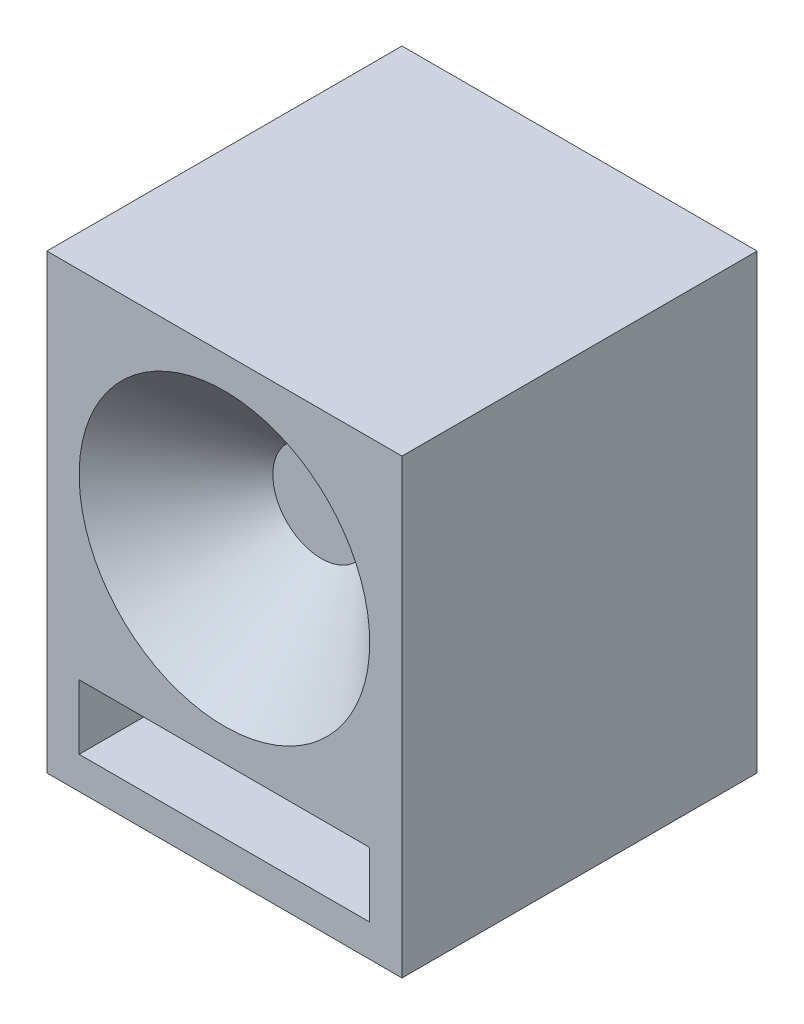
ISO-10303-21;
HEADER;
FILE_DESCRIPTION(('STEP AP214'),'2;1');
FILE_NAME('part.step','',(''),(''),'','','');
FILE_SCHEMA(('AUTOMOTIVE_DESIGN { 1 0 10303 214 1 1 1 1 }'));
ENDSEC;
DATA;
#1=APPLICATION_CONTEXT('core data for automotive mechanical design processes');
#2=APPLICATION_PROTOCOL_DEFINITION('international standard','automotive_design',2000,#1);
#3=PRODUCT_CONTEXT('',#1,'mechanical');
#4=PRODUCT('Part','Part','',(#3));
#5=PRODUCT_RELATED_PRODUCT_CATEGORY('part','',(#4));
#6=PRODUCT_DEFINITION_FORMATION('','',#4);
#7=PRODUCT_DEFINITION_CONTEXT('part definition',#1,'design');
#8=PRODUCT_DEFINITION('design','',#6,#7);
#9=PRODUCT_DEFINITION_SHAPE('','',#8);
#10=(LENGTH_UNIT() NAMED_UNIT(*) SI_UNIT(.MILLI.,.METRE.));
#11=(NAMED_UNIT(*) PLANE_ANGLE_UNIT() SI_UNIT($,.RADIAN.));
#12=(NAMED_UNIT(*) SI_UNIT($,.STERADIAN.) SOLID_ANGLE_UNIT());
#13=UNCERTAINTY_MEASURE_WITH_UNIT(LENGTH_MEASURE(1.E-05),#10,'distance_accuracy_value','');
#14=(GEOMETRIC_REPRESENTATION_CONTEXT(3) GLOBAL_UNCERTAINTY_ASSIGNED_CONTEXT((#13)) GLOBAL_UNIT_ASSIGNED_CONTEXT((#10,
#11,#12)) REPRESENTATION_CONTEXT('',''));
#15=CARTESIAN_POINT('',(0.,0.,0.));
#16=DIRECTION('',(0.,0.,1.));
#17=DIRECTION('',(1.,0.,0.));
#18=AXIS2_PLACEMENT_3D('',#15,#16,#17);
#19=CARTESIAN_POINT('',(279.4,-431.8,558.8));
#20=DIRECTION('',(-1.,0.,0.));
#21=DIRECTION('',(0.,0.,1.));
#22=AXIS2_PLACEMENT_3D('',#19,#20,#21);
#23=PLANE('',#22);
#24=DIRECTION('',(0.,1.,0.));
#25=VECTOR('',#24,1.);
#26=CARTESIAN_POINT('',(279.4,-431.8,0.));
#27=LINE('',#26,#25);
#28=CARTESIAN_POINT('',(279.4,-431.8,0.));
#29=VERTEX_POINT('',#28);
#30=CARTESIAN_POINT('',(279.4,279.4,0.));
#31=VERTEX_POINT('',#30);
#32=EDGE_CURVE('E150',#29,#31,#27,.T.);
#33=ORIENTED_EDGE('',*,*,#32,.T.);
#34=DIRECTION('',(0.,0.,-1.));
#35=VECTOR('',#34,1.);
#36=CARTESIAN_POINT('',(279.4,279.4,558.8));
#37=LINE('',#36,#35);
#38=CARTESIAN_POINT('',(279.4,279.4,558.8));
#39=VERTEX_POINT('',#38);
#40=EDGE_CURVE('E42',#39,#31,#37,.T.);
#41=ORIENTED_EDGE('',*,*,#40,.F.);
#42=DIRECTION('',(0.,1.,0.));
#43=VECTOR('',#42,1.);
#44=CARTESIAN_POINT('',(279.4,-431.8,558.8));
#45=LINE('',#44,#43);
#46=CARTESIAN_POINT('',(279.4,-431.8,558.8));
#47=VERTEX_POINT('',#46);
#48=EDGE_CURVE('E151',#47,#39,#45,.T.);
#49=ORIENTED_EDGE('',*,*,#48,.F.);
#50=DIRECTION('',(0.,0.,-1.));
#51=VECTOR('',#50,1.);
#52=CARTESIAN_POINT('',(279.4,-431.8,558.8));
#53=LINE('',#52,#51);
#54=EDGE_CURVE('E157',#47,#29,#53,.T.);
#55=ORIENTED_EDGE('',*,*,#54,.T.);
#56=EDGE_LOOP('',(#33,#41,#49,#55));
#57=FACE_BOUND('',#56,.T.);
#58=ADVANCED_FACE('F34',(#57),#23,.F.);
#59=CARTESIAN_POINT('',(-279.4,279.4,558.8));
#60=DIRECTION('',(0.,-1.,0.));
#61=DIRECTION('',(0.,0.,-1.));
#62=AXIS2_PLACEMENT_3D('',#59,#60,#61);
#63=PLANE('',#62);
#64=DIRECTION('',(-1.,0.,0.));
#65=VECTOR('',#64,1.);
#66=CARTESIAN_POINT('',(-279.4,279.4,0.));
#67=LINE('',#66,#65);
#68=CARTESIAN_POINT('',(-279.4,279.4,0.));
#69=VERTEX_POINT('',#68);
#70=EDGE_CURVE('E160',#31,#69,#67,.T.);
#71=ORIENTED_EDGE('',*,*,#70,.T.);
#72=DIRECTION('',(0.,0.,-1.));
#73=VECTOR('',#72,1.);
#74=CARTESIAN_POINT('',(-279.4,279.4,558.8));
#75=LINE('',#74,#73);
#76=CARTESIAN_POINT('',(-279.4,279.4,558.8));
#77=VERTEX_POINT('',#76);
#78=EDGE_CURVE('E168',#77,#69,#75,.T.);
#79=ORIENTED_EDGE('',*,*,#78,.F.);
#80=DIRECTION('',(-1.,0.,0.));
#81=VECTOR('',#80,1.);
#82=CARTESIAN_POINT('',(-279.4,279.4,558.8));
#83=LINE('',#82,#81);
#84=EDGE_CURVE('E87',#39,#77,#83,.T.);
#85=ORIENTED_EDGE('',*,*,#84,.F.);
#86=ORIENTED_EDGE('',*,*,#40,.T.);
#87=EDGE_LOOP('',(#71,#79,#85,#86));
#88=FACE_BOUND('',#87,.T.);
#89=ADVANCED_FACE('F171',(#88),#63,.F.);
#90=CARTESIAN_POINT('',(-279.4,-431.8,558.8));
#91=DIRECTION('',(1.,0.,0.));
#92=DIRECTION('',(0.,0.,-1.));
#93=AXIS2_PLACEMENT_3D('',#90,#91,#92);
#94=PLANE('',#93);
#95=DIRECTION('',(0.,-1.,0.));
#96=VECTOR('',#95,1.);
#97=CARTESIAN_POINT('',(-279.4,-431.8,0.));
#98=LINE('',#97,#96);
#99=CARTESIAN_POINT('',(-279.4,-431.8,0.));
#100=VERTEX_POINT('',#99);
#101=EDGE_CURVE('E162',#69,#100,#98,.T.);
#102=ORIENTED_EDGE('',*,*,#101,.T.);
#103=DIRECTION('',(0.,0.,-1.));
#104=VECTOR('',#103,1.);
#105=CARTESIAN_POINT('',(-279.4,-431.8,558.8));
#106=LINE('',#105,#104);
#107=CARTESIAN_POINT('',(-279.4,-431.8,558.8));
#108=VERTEX_POINT('',#107);
#109=EDGE_CURVE('E166',#108,#100,#106,.T.);
#110=ORIENTED_EDGE('',*,*,#109,.F.);
#111=DIRECTION('',(0.,-1.,0.));
#112=VECTOR('',#111,1.);
#113=CARTESIAN_POINT('',(-279.4,-431.8,558.8));
#114=LINE('',#113,#112);
#115=EDGE_CURVE('E154',#77,#108,#114,.T.);
#116=ORIENTED_EDGE('',*,*,#115,.F.);
#117=ORIENTED_EDGE('',*,*,#78,.T.);
#118=EDGE_LOOP('',(#102,#110,#116,#117));
#119=FACE_BOUND('',#118,.T.);
#120=ADVANCED_FACE('F180',(#119),#94,.F.);
#121=CARTESIAN_POINT('',(-279.4,-431.8,558.8));
#122=DIRECTION('',(0.,1.,0.));
#123=DIRECTION('',(0.,0.,1.));
#124=AXIS2_PLACEMENT_3D('',#121,#122,#123);
#125=PLANE('',#124);
#126=DIRECTION('',(1.,0.,0.));
#127=VECTOR('',#126,1.);
#128=CARTESIAN_POINT('',(-279.4,-431.8,0.));
#129=LINE('',#128,#127);
#130=EDGE_CURVE('E79',#100,#29,#129,.T.);
#131=ORIENTED_EDGE('',*,*,#130,.T.);
#132=ORIENTED_EDGE('',*,*,#54,.F.);
#133=DIRECTION('',(1.,0.,0.));
#134=VECTOR('',#133,1.);
#135=CARTESIAN_POINT('',(-279.4,-431.8,558.8));
#136=LINE('',#135,#134);
#137=EDGE_CURVE('E58',#108,#47,#136,.T.);
#138=ORIENTED_EDGE('',*,*,#137,.F.);
#139=ORIENTED_EDGE('',*,*,#109,.T.);
#140=EDGE_LOOP('',(#131,#132,#138,#139));
#141=FACE_BOUND('',#140,.T.);
#142=ADVANCED_FACE('F182',(#141),#125,.F.);
#143=CARTESIAN_POINT('',(0.,0.,558.8));
#144=DIRECTION('',(0.,0.,-1.));
#145=DIRECTION('',(-1.,0.,0.));
#146=AXIS2_PLACEMENT_3D('',#143,#144,#145);
#147=PLANE('',#146);
#148=DIRECTION('',(-1.,0.,0.));
#149=VECTOR('',#148,1.);
#150=CARTESIAN_POINT('',(-228.6,-279.4,558.8));
#151=LINE('',#150,#149);
#152=CARTESIAN_POINT('',(228.6,-279.4,558.8));
#153=VERTEX_POINT('',#152);
#154=CARTESIAN_POINT('',(-228.6,-279.4,558.8));
#155=VERTEX_POINT('',#154);
#156=EDGE_CURVE('E138',#153,#155,#151,.T.);
#157=ORIENTED_EDGE('',*,*,#156,.F.);
#158=DIRECTION('',(0.,1.,0.));
#159=VECTOR('',#158,1.);
#160=CARTESIAN_POINT('',(228.6,-381.,558.8));
#161=LINE('',#160,#159);
#162=CARTESIAN_POINT('',(228.6,-381.,558.8));
#163=VERTEX_POINT('',#162);
#164=EDGE_CURVE('E49',#163,#153,#161,.T.);
#165=ORIENTED_EDGE('',*,*,#164,.F.);
#166=DIRECTION('',(1.,0.,0.));
#167=VECTOR('',#166,1.);
#168=CARTESIAN_POINT('',(-228.6,-381.,558.8));
#169=LINE('',#168,#167);
#170=CARTESIAN_POINT('',(-228.6,-381.,558.8));
#171=VERTEX_POINT('',#170);
#172=EDGE_CURVE('E129',#171,#163,#169,.T.);
#173=ORIENTED_EDGE('',*,*,#172,.F.);
#174=DIRECTION('',(0.,-1.,0.));
#175=VECTOR('',#174,1.);
#176=CARTESIAN_POINT('',(-228.6,-381.,558.8));
#177=LINE('',#176,#175);
#178=EDGE_CURVE('E132',#155,#171,#177,.T.);
#179=ORIENTED_EDGE('',*,*,#178,.F.);
#180=EDGE_LOOP('',(#157,#165,#173,#179));
#181=FACE_BOUND('',#180,.T.);
#182=CARTESIAN_POINT('',(0.,0.,558.8));
#183=DIRECTION('',(0.,0.,1.));
#184=DIRECTION('',(1.,0.,0.));
#185=AXIS2_PLACEMENT_3D('',#182,#183,#184);
#186=CIRCLE('',#185,228.6);
#187=CARTESIAN_POINT('',(228.600000000001,0.,558.8));
#188=VERTEX_POINT('',#187);
#189=EDGE_CURVE('E144',#188,#188,#186,.T.);
#190=ORIENTED_EDGE('',*,*,#189,.F.);
#191=EDGE_LOOP('',(#190));
#192=FACE_BOUND('',#191,.T.);
#193=ORIENTED_EDGE('',*,*,#48,.T.);
#194=ORIENTED_EDGE('',*,*,#84,.T.);
#195=ORIENTED_EDGE('',*,*,#115,.T.);
#196=ORIENTED_EDGE('',*,*,#137,.T.);
#197=EDGE_LOOP('',(#193,#194,#195,#196));
#198=FACE_BOUND('',#197,.T.);
#199=ADVANCED_FACE('F183',(#181,#192,#198),#147,.F.);
#200=CARTESIAN_POINT('',(0.,0.,0.));
#201=DIRECTION('',(0.,0.,-1.));
#202=DIRECTION('',(-1.,0.,0.));
#203=AXIS2_PLACEMENT_3D('',#200,#201,#202);
#204=PLANE('',#203);
#205=ORIENTED_EDGE('',*,*,#32,.F.);
#206=ORIENTED_EDGE('',*,*,#130,.F.);
#207=ORIENTED_EDGE('',*,*,#101,.F.);
#208=ORIENTED_EDGE('',*,*,#70,.F.);
#209=EDGE_LOOP('',(#205,#206,#207,#208));
#210=FACE_BOUND('',#209,.T.);
#211=ADVANCED_FACE('F176',(#210),#204,.T.);
#212=CARTESIAN_POINT('',(0.,0.,406.4));
#213=DIRECTION('',(0.,0.,1.));
#214=DIRECTION('',(1.,0.,0.));
#215=AXIS2_PLACEMENT_3D('',#212,#213,#214);
#216=PLANE('',#215);
#217=CARTESIAN_POINT('',(0.,0.,406.4));
#218=DIRECTION('',(0.,0.,1.));
#219=DIRECTION('',(1.,0.,0.));
#220=AXIS2_PLACEMENT_3D('',#217,#218,#219);
#221=CIRCLE('',#220,76.1999999999997);
#222=CARTESIAN_POINT('',(76.1999999999997,0.,406.4));
#223=VERTEX_POINT('',#222);
#224=EDGE_CURVE('E11',#223,#223,#221,.T.);
#225=ORIENTED_EDGE('',*,*,#224,.T.);
#226=EDGE_LOOP('',(#225));
#227=FACE_BOUND('',#226,.T.);
#228=ADVANCED_FACE('F191',(#227),#216,.T.);
#229=CARTESIAN_POINT('',(228.6,-381.,406.4));
#230=DIRECTION('',(1.,0.,0.));
#231=DIRECTION('',(0.,1.,0.));
#232=AXIS2_PLACEMENT_3D('',#229,#230,#231);
#233=PLANE('',#232);
#234=ORIENTED_EDGE('',*,*,#164,.T.);
#235=DIRECTION('',(0.,0.,1.));
#236=VECTOR('',#235,1.);
#237=CARTESIAN_POINT('',(228.6,-279.4,406.4));
#238=LINE('',#237,#236);
#239=CARTESIAN_POINT('',(228.6,-279.4,406.4));
#240=VERTEX_POINT('',#239);
#241=EDGE_CURVE('E107',#240,#153,#238,.T.);
#242=ORIENTED_EDGE('',*,*,#241,.F.);
#243=DIRECTION('',(0.,1.,0.));
#244=VECTOR('',#243,1.);
#245=CARTESIAN_POINT('',(228.6,-381.,406.4));
#246=LINE('',#245,#244);
#247=CARTESIAN_POINT('',(228.6,-381.,406.4));
#248=VERTEX_POINT('',#247);
#249=EDGE_CURVE('E111',#248,#240,#246,.T.);
#250=ORIENTED_EDGE('',*,*,#249,.F.);
#251=DIRECTION('',(0.,0.,1.));
#252=VECTOR('',#251,1.);
#253=CARTESIAN_POINT('',(228.6,-381.,406.4));
#254=LINE('',#253,#252);
#255=EDGE_CURVE('E142',#248,#163,#254,.T.);
#256=ORIENTED_EDGE('',*,*,#255,.T.);
#257=EDGE_LOOP('',(#234,#242,#250,#256));
#258=FACE_BOUND('',#257,.T.);
#259=ADVANCED_FACE('F109',(#258),#233,.F.);
#260=CARTESIAN_POINT('',(-228.6,-381.,406.4));
#261=DIRECTION('',(0.,-1.,0.));
#262=DIRECTION('',(0.,0.,-1.));
#263=AXIS2_PLACEMENT_3D('',#260,#261,#262);
#264=PLANE('',#263);
#265=ORIENTED_EDGE('',*,*,#172,.T.);
#266=ORIENTED_EDGE('',*,*,#255,.F.);
#267=DIRECTION('',(1.,0.,0.));
#268=VECTOR('',#267,1.);
#269=CARTESIAN_POINT('',(-228.6,-381.,406.4));
#270=LINE('',#269,#268);
#271=CARTESIAN_POINT('',(-228.6,-381.,406.4));
#272=VERTEX_POINT('',#271);
#273=EDGE_CURVE('E117',#272,#248,#270,.T.);
#274=ORIENTED_EDGE('',*,*,#273,.F.);
#275=DIRECTION('',(0.,0.,1.));
#276=VECTOR('',#275,1.);
#277=CARTESIAN_POINT('',(-228.6,-381.,406.4));
#278=LINE('',#277,#276);
#279=EDGE_CURVE('E145',#272,#171,#278,.T.);
#280=ORIENTED_EDGE('',*,*,#279,.T.);
#281=EDGE_LOOP('',(#265,#266,#274,#280));
#282=FACE_BOUND('',#281,.T.);
#283=ADVANCED_FACE('F232',(#282),#264,.F.);
#284=CARTESIAN_POINT('',(-228.6,-381.,406.4));
#285=DIRECTION('',(-1.,0.,0.));
#286=DIRECTION('',(0.,0.,1.));
#287=AXIS2_PLACEMENT_3D('',#284,#285,#286);
#288=PLANE('',#287);
#289=ORIENTED_EDGE('',*,*,#178,.T.);
#290=ORIENTED_EDGE('',*,*,#279,.F.);
#291=DIRECTION('',(0.,-1.,0.));
#292=VECTOR('',#291,1.);
#293=CARTESIAN_POINT('',(-228.6,-381.,406.4));
#294=LINE('',#293,#292);
#295=CARTESIAN_POINT('',(-228.6,-279.4,406.4));
#296=VERTEX_POINT('',#295);
#297=EDGE_CURVE('E125',#296,#272,#294,.T.);
#298=ORIENTED_EDGE('',*,*,#297,.F.);
#299=DIRECTION('',(0.,0.,1.));
#300=VECTOR('',#299,1.);
#301=CARTESIAN_POINT('',(-228.6,-279.4,406.4));
#302=LINE('',#301,#300);
#303=EDGE_CURVE('E116',#296,#155,#302,.T.);
#304=ORIENTED_EDGE('',*,*,#303,.T.);
#305=EDGE_LOOP('',(#289,#290,#298,#304));
#306=FACE_BOUND('',#305,.T.);
#307=ADVANCED_FACE('F241',(#306),#288,.F.);
#308=CARTESIAN_POINT('',(-228.6,-279.4,406.4));
#309=DIRECTION('',(0.,1.,0.));
#310=DIRECTION('',(0.,0.,1.));
#311=AXIS2_PLACEMENT_3D('',#308,#309,#310);
#312=PLANE('',#311);
#313=ORIENTED_EDGE('',*,*,#156,.T.);
#314=ORIENTED_EDGE('',*,*,#303,.F.);
#315=DIRECTION('',(-1.,0.,0.));
#316=VECTOR('',#315,1.);
#317=CARTESIAN_POINT('',(-228.6,-279.4,406.4));
#318=LINE('',#317,#316);
#319=EDGE_CURVE('E120',#240,#296,#318,.T.);
#320=ORIENTED_EDGE('',*,*,#319,.F.);
#321=ORIENTED_EDGE('',*,*,#241,.T.);
#322=EDGE_LOOP('',(#313,#314,#320,#321));
#323=FACE_BOUND('',#322,.T.);
#324=ADVANCED_FACE('F121',(#323),#312,.F.);
#325=CARTESIAN_POINT('',(0.,0.,406.4));
#326=DIRECTION('',(0.,0.,-1.));
#327=DIRECTION('',(-1.,0.,0.));
#328=AXIS2_PLACEMENT_3D('',#325,#326,#327);
#329=PLANE('',#328);
#330=ORIENTED_EDGE('',*,*,#249,.T.);
#331=ORIENTED_EDGE('',*,*,#319,.T.);
#332=ORIENTED_EDGE('',*,*,#297,.T.);
#333=ORIENTED_EDGE('',*,*,#273,.T.);
#334=EDGE_LOOP('',(#330,#331,#332,#333));
#335=FACE_BOUND('',#334,.T.);
#336=ADVANCED_FACE('F127',(#335),#329,.F.);
#337=CARTESIAN_POINT('',(0.,0.,406.4));
#338=DIRECTION('',(0.,0.,1.));
#339=DIRECTION('',(1.,0.,0.));
#340=AXIS2_PLACEMENT_3D('',#337,#338,#339);
#341=CONICAL_SURFACE('',#340,76.1999999999997,0.785398163397453);
#342=CARTESIAN_POINT('',(228.600000000001,0.,558.8));
#343=CARTESIAN_POINT('',(227.012500000001,0.,557.2125));
#344=CARTESIAN_POINT('',(225.425000000001,0.,555.625));
#345=CARTESIAN_POINT('',(222.250000000001,0.,552.45));
#346=CARTESIAN_POINT('',(220.662500000001,0.,550.8625));
#347=CARTESIAN_POINT('',(217.487500000001,0.,547.6875));
#348=CARTESIAN_POINT('',(215.900000000001,0.,546.1));
#349=CARTESIAN_POINT('',(212.725000000001,0.,542.925));
#350=CARTESIAN_POINT('',(211.137500000001,0.,541.3375));
#351=CARTESIAN_POINT('',(207.962500000001,0.,538.1625));
#352=CARTESIAN_POINT('',(206.375000000001,0.,536.575));
#353=CARTESIAN_POINT('',(203.200000000001,0.,533.4));
#354=CARTESIAN_POINT('',(201.612500000001,0.,531.8125));
#355=CARTESIAN_POINT('',(198.437500000001,0.,528.6375));
#356=CARTESIAN_POINT('',(196.850000000001,0.,527.05));
#357=CARTESIAN_POINT('',(193.675000000001,0.,523.875));
#358=CARTESIAN_POINT('',(192.087500000001,0.,522.2875));
#359=CARTESIAN_POINT('',(188.912500000001,0.,519.1125));
#360=CARTESIAN_POINT('',(187.325000000001,0.,517.525));
#361=CARTESIAN_POINT('',(184.150000000001,0.,514.35));
#362=CARTESIAN_POINT('',(182.562500000001,0.,512.7625));
#363=CARTESIAN_POINT('',(179.387500000001,0.,509.5875));
#364=CARTESIAN_POINT('',(177.800000000001,0.,508.));
#365=CARTESIAN_POINT('',(174.625000000001,0.,504.825));
#366=CARTESIAN_POINT('',(173.037500000001,0.,503.2375));
#367=CARTESIAN_POINT('',(169.862500000001,0.,500.0625));
#368=CARTESIAN_POINT('',(168.275000000001,0.,498.475));
#369=CARTESIAN_POINT('',(165.1,0.,495.3));
#370=CARTESIAN_POINT('',(163.5125,0.,493.7125));
#371=CARTESIAN_POINT('',(160.3375,0.,490.5375));
#372=CARTESIAN_POINT('',(158.75,0.,488.95));
#373=CARTESIAN_POINT('',(155.575,0.,485.775));
#374=CARTESIAN_POINT('',(153.9875,0.,484.1875));
#375=CARTESIAN_POINT('',(150.8125,0.,481.0125));
#376=CARTESIAN_POINT('',(149.225,0.,479.425));
#377=CARTESIAN_POINT('',(146.05,0.,476.25));
#378=CARTESIAN_POINT('',(144.4625,0.,474.6625));
#379=CARTESIAN_POINT('',(141.2875,0.,471.4875));
#380=CARTESIAN_POINT('',(139.7,0.,469.9));
#381=CARTESIAN_POINT('',(136.525,0.,466.725));
#382=CARTESIAN_POINT('',(134.9375,0.,465.1375));
#383=CARTESIAN_POINT('',(131.7625,0.,461.9625));
#384=CARTESIAN_POINT('',(130.175,0.,460.375));
#385=CARTESIAN_POINT('',(127.,0.,457.2));
#386=CARTESIAN_POINT('',(125.4125,0.,455.6125));
#387=CARTESIAN_POINT('',(122.2375,0.,452.4375));
#388=CARTESIAN_POINT('',(120.65,0.,450.85));
#389=CARTESIAN_POINT('',(117.475,0.,447.675));
#390=CARTESIAN_POINT('',(115.8875,0.,446.0875));
#391=CARTESIAN_POINT('',(112.7125,0.,442.9125));
#392=CARTESIAN_POINT('',(111.125,0.,441.325));
#393=CARTESIAN_POINT('',(107.95,0.,438.15));
#394=CARTESIAN_POINT('',(106.3625,0.,436.5625));
#395=CARTESIAN_POINT('',(103.1875,0.,433.3875));
#396=CARTESIAN_POINT('',(101.6,0.,431.8));
#397=CARTESIAN_POINT('',(98.4249999999998,0.,428.625));
#398=CARTESIAN_POINT('',(96.8374999999998,0.,427.0375));
#399=CARTESIAN_POINT('',(93.6624999999998,0.,423.8625));
#400=CARTESIAN_POINT('',(92.0749999999998,0.,422.275));
#401=CARTESIAN_POINT('',(88.8999999999998,0.,419.1));
#402=CARTESIAN_POINT('',(87.3124999999998,0.,417.5125));
#403=CARTESIAN_POINT('',(84.1374999999997,0.,414.3375));
#404=CARTESIAN_POINT('',(82.5499999999997,0.,412.75));
#405=CARTESIAN_POINT('',(79.3749999999997,0.,409.575));
#406=CARTESIAN_POINT('',(77.7874999999997,0.,407.9875));
#407=CARTESIAN_POINT('',(76.1999999999997,0.,406.4));
#408=B_SPLINE_CURVE_WITH_KNOTS('',3,(#342,#343,#344,#345,#346,#347,#348,#349,#350,#351,#352,
#353,#354,#355,#356,#357,#358,#359,#360,#361,#362,#363,#364,#365,#366,#367,#368,#369,#370,#371,
#372,#373,#374,#375,#376,#377,#378,#379,#380,#381,#382,#383,#384,#385,#386,#387,#388,#389,#390,
#391,#392,#393,#394,#395,#396,#397,#398,#399,#400,#401,#402,#403,#404,#405,#406,#407),
.UNSPECIFIED.,.F.,.F.,(4,2,2,2,2,2,2,2,2,2,2,2,2,2,2,2,2,2,2,2,2,2,2,2,2,2,2,2,2,2,2,2,4),(0.,
6.73519209080189,13.4703841816038,20.2055762724057,26.9407683632076,33.6759604540095,
40.4111525448114,47.1463446356133,53.8815367264152,60.6167288172171,67.351920908019,
74.0871129988208,80.8223050896227,87.5574971804247,94.2926892712266,101.027881362028,
107.76307345283,114.498265543632,121.233457634434,127.968649725236,134.703841816038,
141.43903390684,148.174225997642,154.909418088444,161.644610179245,168.379802270047,
175.114994360849,181.850186451651,188.585378542453,195.320570633255,202.055762724057,
208.790954814859,215.526146905661),.UNSPECIFIED.);
#409=EDGE_CURVE('BSEAM36',#188,#223,#408,.T.);
#410=ORIENTED_EDGE('',*,*,#189,.T.);
#411=ORIENTED_EDGE('',*,*,#224,.F.);
#412=ORIENTED_EDGE('',*,*,#409,.T.);
#413=ORIENTED_EDGE('',*,*,#409,.F.);
#414=EDGE_LOOP('',(#410,#412,#411,#413));
#415=FACE_BOUND('',#414,.T.);
#416=ADVANCED_FACE('F36',(#415),#341,.F.);
#417=CLOSED_SHELL('',(#58,#89,#120,#142,#199,#211,#228,#259,#283,#307,#324,#336,#416));
#418=MANIFOLD_SOLID_BREP('B2',#417);
#419=ADVANCED_BREP_SHAPE_REPRESENTATION('',(#18,#418),#14);
#420=SHAPE_DEFINITION_REPRESENTATION(#9,#419);
ENDSEC;
END-ISO-10303-21;
